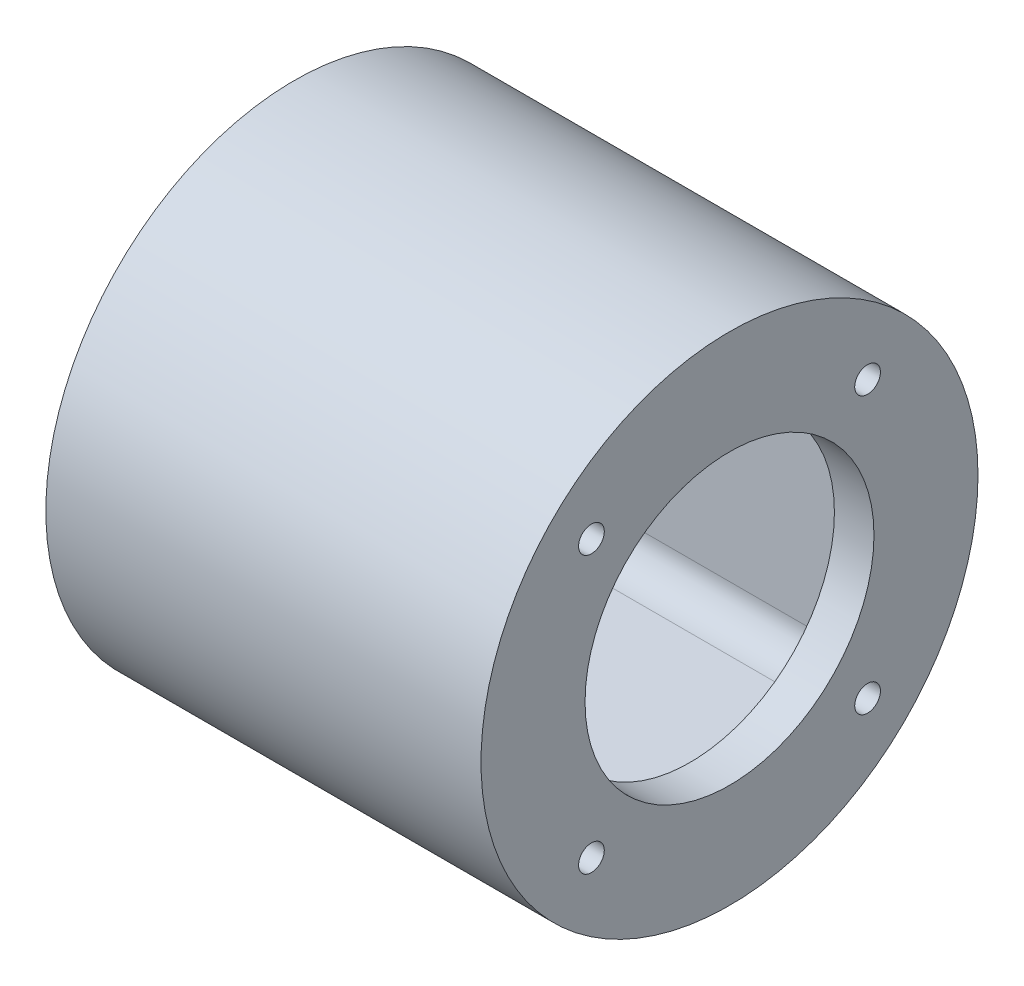
ISO-10303-21;
HEADER;
FILE_DESCRIPTION(('STEP AP214'),'2;1');
FILE_NAME('part.step','',(''),(''),'','','');
FILE_SCHEMA(('AUTOMOTIVE_DESIGN { 1 0 10303 214 1 1 1 1 }'));
ENDSEC;
DATA;
#1=APPLICATION_CONTEXT('core data for automotive mechanical design processes');
#2=APPLICATION_PROTOCOL_DEFINITION('international standard','automotive_design',2000,#1);
#3=PRODUCT_CONTEXT('',#1,'mechanical');
#4=PRODUCT('Part','Part','',(#3));
#5=PRODUCT_RELATED_PRODUCT_CATEGORY('part','',(#4));
#6=PRODUCT_DEFINITION_FORMATION('','',#4);
#7=PRODUCT_DEFINITION_CONTEXT('part definition',#1,'design');
#8=PRODUCT_DEFINITION('design','',#6,#7);
#9=PRODUCT_DEFINITION_SHAPE('','',#8);
#10=(LENGTH_UNIT() NAMED_UNIT(*) SI_UNIT(.MILLI.,.METRE.));
#11=(NAMED_UNIT(*) PLANE_ANGLE_UNIT() SI_UNIT($,.RADIAN.));
#12=(NAMED_UNIT(*) SI_UNIT($,.STERADIAN.) SOLID_ANGLE_UNIT());
#13=UNCERTAINTY_MEASURE_WITH_UNIT(LENGTH_MEASURE(1.E-05),#10,'distance_accuracy_value','');
#14=(GEOMETRIC_REPRESENTATION_CONTEXT(3) GLOBAL_UNCERTAINTY_ASSIGNED_CONTEXT((#13)) GLOBAL_UNIT_ASSIGNED_CONTEXT((#10,
#11,#12)) REPRESENTATION_CONTEXT('',''));
#15=CARTESIAN_POINT('',(0.,0.,0.));
#16=DIRECTION('',(0.,0.,1.));
#17=DIRECTION('',(1.,0.,0.));
#18=AXIS2_PLACEMENT_3D('',#15,#16,#17);
#19=CARTESIAN_POINT('',(0.,0.,0.));
#20=DIRECTION('',(1.,0.,0.));
#21=DIRECTION('',(0.,0.,-1.));
#22=AXIS2_PLACEMENT_3D('',#19,#20,#21);
#23=PLANE('',#22);
#24=CARTESIAN_POINT('',(0.,0.,0.));
#25=DIRECTION('',(1.,0.,0.));
#26=DIRECTION('',(0.,0.,-1.));
#27=AXIS2_PLACEMENT_3D('',#24,#25,#26);
#28=CIRCLE('',#27,36.5175);
#29=CARTESIAN_POINT('',(0.,0.,-36.5175));
#30=VERTEX_POINT('',#29);
#31=EDGE_CURVE('E45',#30,#30,#28,.T.);
#32=ORIENTED_EDGE('',*,*,#31,.T.);
#33=EDGE_LOOP('',(#32));
#34=FACE_BOUND('',#33,.T.);
#35=CARTESIAN_POINT('',(0.,34.9,34.9));
#36=DIRECTION('',(1.,0.,0.));
#37=DIRECTION('',(0.,0.,-1.));
#38=AXIS2_PLACEMENT_3D('',#35,#36,#37);
#39=CIRCLE('',#38,3.25);
#40=CARTESIAN_POINT('',(0.,34.9,31.65));
#41=VERTEX_POINT('',#40);
#42=EDGE_CURVE('E237',#41,#41,#39,.T.);
#43=ORIENTED_EDGE('',*,*,#42,.T.);
#44=EDGE_LOOP('',(#43));
#45=FACE_BOUND('',#44,.T.);
#46=CARTESIAN_POINT('',(0.,34.9,-34.9));
#47=DIRECTION('',(1.,0.,0.));
#48=DIRECTION('',(0.,0.,-1.));
#49=AXIS2_PLACEMENT_3D('',#46,#47,#48);
#50=CIRCLE('',#49,3.25);
#51=CARTESIAN_POINT('',(0.,34.9,-38.15));
#52=VERTEX_POINT('',#51);
#53=EDGE_CURVE('E234',#52,#52,#50,.T.);
#54=ORIENTED_EDGE('',*,*,#53,.T.);
#55=EDGE_LOOP('',(#54));
#56=FACE_BOUND('',#55,.T.);
#57=CARTESIAN_POINT('',(0.,-34.9,-34.9));
#58=DIRECTION('',(1.,0.,0.));
#59=DIRECTION('',(0.,0.,-1.));
#60=AXIS2_PLACEMENT_3D('',#57,#58,#59);
#61=CIRCLE('',#60,3.25);
#62=CARTESIAN_POINT('',(0.,-34.9,-38.15));
#63=VERTEX_POINT('',#62);
#64=EDGE_CURVE('E230',#63,#63,#61,.T.);
#65=ORIENTED_EDGE('',*,*,#64,.T.);
#66=EDGE_LOOP('',(#65));
#67=FACE_BOUND('',#66,.T.);
#68=CARTESIAN_POINT('',(0.,-34.9,34.9));
#69=DIRECTION('',(1.,0.,0.));
#70=DIRECTION('',(0.,0.,-1.));
#71=AXIS2_PLACEMENT_3D('',#68,#69,#70);
#72=CIRCLE('',#71,3.25);
#73=CARTESIAN_POINT('',(0.,-34.9,31.65));
#74=VERTEX_POINT('',#73);
#75=EDGE_CURVE('E185',#74,#74,#72,.T.);
#76=ORIENTED_EDGE('',*,*,#75,.T.);
#77=EDGE_LOOP('',(#76));
#78=FACE_BOUND('',#77,.T.);
#79=CARTESIAN_POINT('',(0.,34.9,-34.9));
#80=DIRECTION('',(1.,0.,0.));
#81=DIRECTION('',(0.,0.,-1.));
#82=AXIS2_PLACEMENT_3D('',#79,#80,#81);
#83=CIRCLE('',#82,8.1);
#84=CARTESIAN_POINT('',(0.,34.9,-43.));
#85=VERTEX_POINT('',#84);
#86=CARTESIAN_POINT('',(0.,43.,-34.9));
#87=VERTEX_POINT('',#86);
#88=EDGE_CURVE('E59',#85,#87,#83,.T.);
#89=ORIENTED_EDGE('',*,*,#88,.F.);
#90=DIRECTION('',(0.,1.,0.));
#91=VECTOR('',#90,1.);
#92=CARTESIAN_POINT('',(0.,0.,-43.));
#93=LINE('',#92,#91);
#94=CARTESIAN_POINT('',(0.,-34.9,-43.));
#95=VERTEX_POINT('',#94);
#96=EDGE_CURVE('E63',#95,#85,#93,.T.);
#97=ORIENTED_EDGE('',*,*,#96,.F.);
#98=CARTESIAN_POINT('',(0.,-34.9,-34.9));
#99=DIRECTION('',(1.,0.,0.));
#100=DIRECTION('',(0.,0.,-1.));
#101=AXIS2_PLACEMENT_3D('',#98,#99,#100);
#102=CIRCLE('',#101,8.10000000000001);
#103=CARTESIAN_POINT('',(0.,-43.,-34.9));
#104=VERTEX_POINT('',#103);
#105=EDGE_CURVE('E167',#104,#95,#102,.T.);
#106=ORIENTED_EDGE('',*,*,#105,.F.);
#107=DIRECTION('',(0.,0.,1.));
#108=VECTOR('',#107,1.);
#109=CARTESIAN_POINT('',(0.,-43.,0.));
#110=LINE('',#109,#108);
#111=CARTESIAN_POINT('',(0.,-43.,34.9));
#112=VERTEX_POINT('',#111);
#113=EDGE_CURVE('E170',#104,#112,#110,.T.);
#114=ORIENTED_EDGE('',*,*,#113,.T.);
#115=CARTESIAN_POINT('',(0.,-34.9,34.9));
#116=DIRECTION('',(1.,0.,0.));
#117=DIRECTION('',(0.,0.,-1.));
#118=AXIS2_PLACEMENT_3D('',#115,#116,#117);
#119=CIRCLE('',#118,8.09999999999999);
#120=CARTESIAN_POINT('',(0.,-34.9,43.));
#121=VERTEX_POINT('',#120);
#122=EDGE_CURVE('E173',#121,#112,#119,.T.);
#123=ORIENTED_EDGE('',*,*,#122,.F.);
#124=DIRECTION('',(0.,1.,0.));
#125=VECTOR('',#124,1.);
#126=CARTESIAN_POINT('',(0.,0.,43.));
#127=LINE('',#126,#125);
#128=CARTESIAN_POINT('',(0.,34.9,43.));
#129=VERTEX_POINT('',#128);
#130=EDGE_CURVE('E177',#121,#129,#127,.T.);
#131=ORIENTED_EDGE('',*,*,#130,.T.);
#132=CARTESIAN_POINT('',(0.,34.9,34.9));
#133=DIRECTION('',(1.,0.,0.));
#134=DIRECTION('',(0.,0.,-1.));
#135=AXIS2_PLACEMENT_3D('',#132,#133,#134);
#136=CIRCLE('',#135,8.09999999999998);
#137=CARTESIAN_POINT('',(0.,43.,34.9));
#138=VERTEX_POINT('',#137);
#139=EDGE_CURVE('E138',#138,#129,#136,.T.);
#140=ORIENTED_EDGE('',*,*,#139,.F.);
#141=DIRECTION('',(0.,0.,1.));
#142=VECTOR('',#141,1.);
#143=CARTESIAN_POINT('',(0.,43.,0.));
#144=LINE('',#143,#142);
#145=EDGE_CURVE('E134',#87,#138,#144,.T.);
#146=ORIENTED_EDGE('',*,*,#145,.F.);
#147=EDGE_LOOP('',(#89,#97,#106,#114,#123,#131,#140,#146));
#148=FACE_BOUND('',#147,.T.);
#149=ADVANCED_FACE('F41',(#34,#45,#56,#67,#78,#148),#23,.F.);
#150=CARTESIAN_POINT('',(10.,0.,0.));
#151=DIRECTION('',(-1.,0.,0.));
#152=DIRECTION('',(0.,0.,1.));
#153=AXIS2_PLACEMENT_3D('',#150,#151,#152);
#154=CYLINDRICAL_SURFACE('',#153,36.5175);
#155=CARTESIAN_POINT('',(10.,0.,0.));
#156=DIRECTION('',(1.,0.,0.));
#157=DIRECTION('',(0.,0.,-1.));
#158=AXIS2_PLACEMENT_3D('',#155,#156,#157);
#159=CIRCLE('',#158,36.5175);
#160=CARTESIAN_POINT('',(10.,0.,-36.5175));
#161=VERTEX_POINT('',#160);
#162=EDGE_CURVE('E51',#161,#161,#159,.T.);
#163=ORIENTED_EDGE('',*,*,#162,.T.);
#164=EDGE_LOOP('',(#163));
#165=FACE_BOUND('',#164,.T.);
#166=ORIENTED_EDGE('',*,*,#31,.F.);
#167=EDGE_LOOP('',(#166));
#168=FACE_BOUND('',#167,.T.);
#169=ADVANCED_FACE('F247',(#165,#168),#154,.F.);
#170=CARTESIAN_POINT('',(10.,34.9,34.9));
#171=DIRECTION('',(-1.,0.,0.));
#172=DIRECTION('',(0.,0.,1.));
#173=AXIS2_PLACEMENT_3D('',#170,#171,#172);
#174=CYLINDRICAL_SURFACE('',#173,3.25);
#175=CARTESIAN_POINT('',(10.,34.9,34.9));
#176=DIRECTION('',(1.,0.,0.));
#177=DIRECTION('',(0.,0.,-1.));
#178=AXIS2_PLACEMENT_3D('',#175,#176,#177);
#179=CIRCLE('',#178,3.25);
#180=CARTESIAN_POINT('',(10.,34.9,31.65));
#181=VERTEX_POINT('',#180);
#182=EDGE_CURVE('E220',#181,#181,#179,.T.);
#183=ORIENTED_EDGE('',*,*,#182,.T.);
#184=EDGE_LOOP('',(#183));
#185=FACE_BOUND('',#184,.T.);
#186=ORIENTED_EDGE('',*,*,#42,.F.);
#187=EDGE_LOOP('',(#186));
#188=FACE_BOUND('',#187,.T.);
#189=ADVANCED_FACE('F249',(#185,#188),#174,.F.);
#190=CARTESIAN_POINT('',(10.,34.9,-34.9));
#191=DIRECTION('',(-1.,0.,0.));
#192=DIRECTION('',(0.,0.,1.));
#193=AXIS2_PLACEMENT_3D('',#190,#191,#192);
#194=CYLINDRICAL_SURFACE('',#193,3.25);
#195=CARTESIAN_POINT('',(10.,34.9,-34.9));
#196=DIRECTION('',(1.,0.,0.));
#197=DIRECTION('',(0.,0.,-1.));
#198=AXIS2_PLACEMENT_3D('',#195,#196,#197);
#199=CIRCLE('',#198,3.25);
#200=CARTESIAN_POINT('',(10.,34.9,-38.15));
#201=VERTEX_POINT('',#200);
#202=EDGE_CURVE('E216',#201,#201,#199,.T.);
#203=ORIENTED_EDGE('',*,*,#202,.T.);
#204=EDGE_LOOP('',(#203));
#205=FACE_BOUND('',#204,.T.);
#206=ORIENTED_EDGE('',*,*,#53,.F.);
#207=EDGE_LOOP('',(#206));
#208=FACE_BOUND('',#207,.T.);
#209=ADVANCED_FACE('F256',(#205,#208),#194,.F.);
#210=CARTESIAN_POINT('',(10.,-34.9,-34.9));
#211=DIRECTION('',(-1.,0.,0.));
#212=DIRECTION('',(0.,0.,1.));
#213=AXIS2_PLACEMENT_3D('',#210,#211,#212);
#214=CYLINDRICAL_SURFACE('',#213,3.25);
#215=CARTESIAN_POINT('',(10.,-34.9,-34.9));
#216=DIRECTION('',(1.,0.,0.));
#217=DIRECTION('',(0.,0.,-1.));
#218=AXIS2_PLACEMENT_3D('',#215,#216,#217);
#219=CIRCLE('',#218,3.25);
#220=CARTESIAN_POINT('',(10.,-34.9,-38.15));
#221=VERTEX_POINT('',#220);
#222=EDGE_CURVE('E212',#221,#221,#219,.T.);
#223=ORIENTED_EDGE('',*,*,#222,.T.);
#224=EDGE_LOOP('',(#223));
#225=FACE_BOUND('',#224,.T.);
#226=ORIENTED_EDGE('',*,*,#64,.F.);
#227=EDGE_LOOP('',(#226));
#228=FACE_BOUND('',#227,.T.);
#229=ADVANCED_FACE('F264',(#225,#228),#214,.F.);
#230=CARTESIAN_POINT('',(10.,-34.9,34.9));
#231=DIRECTION('',(-1.,0.,0.));
#232=DIRECTION('',(0.,0.,1.));
#233=AXIS2_PLACEMENT_3D('',#230,#231,#232);
#234=CYLINDRICAL_SURFACE('',#233,3.25);
#235=CARTESIAN_POINT('',(10.,-34.9,34.9));
#236=DIRECTION('',(1.,0.,0.));
#237=DIRECTION('',(0.,0.,-1.));
#238=AXIS2_PLACEMENT_3D('',#235,#236,#237);
#239=CIRCLE('',#238,3.25);
#240=CARTESIAN_POINT('',(10.,-34.9,31.65));
#241=VERTEX_POINT('',#240);
#242=EDGE_CURVE('E208',#241,#241,#239,.T.);
#243=ORIENTED_EDGE('',*,*,#242,.T.);
#244=EDGE_LOOP('',(#243));
#245=FACE_BOUND('',#244,.T.);
#246=ORIENTED_EDGE('',*,*,#75,.F.);
#247=EDGE_LOOP('',(#246));
#248=FACE_BOUND('',#247,.T.);
#249=ADVANCED_FACE('F43',(#245,#248),#234,.F.);
#250=CARTESIAN_POINT('',(10.,0.,0.));
#251=DIRECTION('',(-1.,0.,0.));
#252=DIRECTION('',(0.,0.,1.));
#253=AXIS2_PLACEMENT_3D('',#250,#251,#252);
#254=CYLINDRICAL_SURFACE('',#253,62.8111831820431);
#255=CARTESIAN_POINT('',(10.,0.,0.));
#256=DIRECTION('',(1.,0.,0.));
#257=DIRECTION('',(0.,0.,-1.));
#258=AXIS2_PLACEMENT_3D('',#255,#256,#257);
#259=CIRCLE('',#258,62.8111831820431);
#260=CARTESIAN_POINT('',(10.,0.,-62.8111831820431));
#261=VERTEX_POINT('',#260);
#262=EDGE_CURVE('E11',#261,#261,#259,.T.);
#263=ORIENTED_EDGE('',*,*,#262,.F.);
#264=EDGE_LOOP('',(#263));
#265=FACE_BOUND('',#264,.T.);
#266=CARTESIAN_POINT('',(-100.,0.,0.));
#267=DIRECTION('',(1.,0.,0.));
#268=DIRECTION('',(0.,0.,-1.));
#269=AXIS2_PLACEMENT_3D('',#266,#267,#268);
#270=CIRCLE('',#269,62.8111831820431);
#271=CARTESIAN_POINT('',(-100.,0.,-62.8111831820431));
#272=VERTEX_POINT('',#271);
#273=EDGE_CURVE('E128',#272,#272,#270,.T.);
#274=ORIENTED_EDGE('',*,*,#273,.T.);
#275=EDGE_LOOP('',(#274));
#276=FACE_BOUND('',#275,.T.);
#277=ADVANCED_FACE('F261',(#265,#276),#254,.T.);
#278=CARTESIAN_POINT('',(10.,0.,0.));
#279=DIRECTION('',(1.,0.,0.));
#280=DIRECTION('',(0.,0.,-1.));
#281=AXIS2_PLACEMENT_3D('',#278,#279,#280);
#282=PLANE('',#281);
#283=ORIENTED_EDGE('',*,*,#242,.F.);
#284=EDGE_LOOP('',(#283));
#285=FACE_BOUND('',#284,.T.);
#286=ORIENTED_EDGE('',*,*,#222,.F.);
#287=EDGE_LOOP('',(#286));
#288=FACE_BOUND('',#287,.T.);
#289=ORIENTED_EDGE('',*,*,#202,.F.);
#290=EDGE_LOOP('',(#289));
#291=FACE_BOUND('',#290,.T.);
#292=ORIENTED_EDGE('',*,*,#182,.F.);
#293=EDGE_LOOP('',(#292));
#294=FACE_BOUND('',#293,.T.);
#295=ORIENTED_EDGE('',*,*,#162,.F.);
#296=EDGE_LOOP('',(#295));
#297=FACE_BOUND('',#296,.T.);
#298=ORIENTED_EDGE('',*,*,#262,.T.);
#299=EDGE_LOOP('',(#298));
#300=FACE_BOUND('',#299,.T.);
#301=ADVANCED_FACE('F280',(#285,#288,#291,#294,#297,#300),#282,.T.);
#302=CARTESIAN_POINT('',(-100.,34.9,-34.9));
#303=DIRECTION('',(1.,0.,0.));
#304=DIRECTION('',(0.,0.,-1.));
#305=AXIS2_PLACEMENT_3D('',#302,#303,#304);
#306=CYLINDRICAL_SURFACE('',#305,8.1);
#307=ORIENTED_EDGE('',*,*,#88,.T.);
#308=DIRECTION('',(1.,0.,0.));
#309=VECTOR('',#308,1.);
#310=CARTESIAN_POINT('',(-100.,43.,-34.9));
#311=LINE('',#310,#309);
#312=CARTESIAN_POINT('',(-100.,43.,-34.9));
#313=VERTEX_POINT('',#312);
#314=EDGE_CURVE('E132',#313,#87,#311,.T.);
#315=ORIENTED_EDGE('',*,*,#314,.F.);
#316=CARTESIAN_POINT('',(-100.,34.9,-34.9));
#317=DIRECTION('',(1.,0.,0.));
#318=DIRECTION('',(0.,0.,-1.));
#319=AXIS2_PLACEMENT_3D('',#316,#317,#318);
#320=CIRCLE('',#319,8.1);
#321=CARTESIAN_POINT('',(-100.,34.9,-43.));
#322=VERTEX_POINT('',#321);
#323=EDGE_CURVE('E112',#322,#313,#320,.T.);
#324=ORIENTED_EDGE('',*,*,#323,.F.);
#325=DIRECTION('',(1.,0.,0.));
#326=VECTOR('',#325,1.);
#327=CARTESIAN_POINT('',(-100.,34.9,-43.));
#328=LINE('',#327,#326);
#329=EDGE_CURVE('E123',#322,#85,#328,.T.);
#330=ORIENTED_EDGE('',*,*,#329,.T.);
#331=EDGE_LOOP('',(#307,#315,#324,#330));
#332=FACE_BOUND('',#331,.T.);
#333=ADVANCED_FACE('F130',(#332),#306,.F.);
#334=CARTESIAN_POINT('',(-100.,43.,0.));
#335=DIRECTION('',(0.,1.,0.));
#336=DIRECTION('',(0.,0.,1.));
#337=AXIS2_PLACEMENT_3D('',#334,#335,#336);
#338=PLANE('',#337);
#339=ORIENTED_EDGE('',*,*,#145,.T.);
#340=DIRECTION('',(1.,0.,0.));
#341=VECTOR('',#340,1.);
#342=CARTESIAN_POINT('',(-100.,43.,34.9));
#343=LINE('',#342,#341);
#344=CARTESIAN_POINT('',(-100.,43.,34.9));
#345=VERTEX_POINT('',#344);
#346=EDGE_CURVE('E186',#345,#138,#343,.T.);
#347=ORIENTED_EDGE('',*,*,#346,.F.);
#348=DIRECTION('',(0.,0.,1.));
#349=VECTOR('',#348,1.);
#350=CARTESIAN_POINT('',(-100.,43.,0.));
#351=LINE('',#350,#349);
#352=EDGE_CURVE('E157',#313,#345,#351,.T.);
#353=ORIENTED_EDGE('',*,*,#352,.F.);
#354=ORIENTED_EDGE('',*,*,#314,.T.);
#355=EDGE_LOOP('',(#339,#347,#353,#354));
#356=FACE_BOUND('',#355,.T.);
#357=ADVANCED_FACE('F304',(#356),#338,.F.);
#358=CARTESIAN_POINT('',(-100.,34.9,34.9));
#359=DIRECTION('',(1.,0.,0.));
#360=DIRECTION('',(0.,0.,-1.));
#361=AXIS2_PLACEMENT_3D('',#358,#359,#360);
#362=CYLINDRICAL_SURFACE('',#361,8.09999999999998);
#363=ORIENTED_EDGE('',*,*,#139,.T.);
#364=DIRECTION('',(1.,0.,0.));
#365=VECTOR('',#364,1.);
#366=CARTESIAN_POINT('',(-100.,34.9,43.));
#367=LINE('',#366,#365);
#368=CARTESIAN_POINT('',(-100.,34.9,43.));
#369=VERTEX_POINT('',#368);
#370=EDGE_CURVE('E190',#369,#129,#367,.T.);
#371=ORIENTED_EDGE('',*,*,#370,.F.);
#372=CARTESIAN_POINT('',(-100.,34.9,34.9));
#373=DIRECTION('',(1.,0.,0.));
#374=DIRECTION('',(0.,0.,-1.));
#375=AXIS2_PLACEMENT_3D('',#372,#373,#374);
#376=CIRCLE('',#375,8.09999999999998);
#377=EDGE_CURVE('E154',#345,#369,#376,.T.);
#378=ORIENTED_EDGE('',*,*,#377,.F.);
#379=ORIENTED_EDGE('',*,*,#346,.T.);
#380=EDGE_LOOP('',(#363,#371,#378,#379));
#381=FACE_BOUND('',#380,.T.);
#382=ADVANCED_FACE('F307',(#381),#362,.F.);
#383=CARTESIAN_POINT('',(-100.,0.,43.));
#384=DIRECTION('',(0.,0.,-1.));
#385=DIRECTION('',(0.,1.,0.));
#386=AXIS2_PLACEMENT_3D('',#383,#384,#385);
#387=PLANE('',#386);
#388=ORIENTED_EDGE('',*,*,#130,.F.);
#389=DIRECTION('',(1.,0.,0.));
#390=VECTOR('',#389,1.);
#391=CARTESIAN_POINT('',(-100.,-34.9,43.));
#392=LINE('',#391,#390);
#393=CARTESIAN_POINT('',(-100.,-34.9,43.));
#394=VERTEX_POINT('',#393);
#395=EDGE_CURVE('E194',#394,#121,#392,.T.);
#396=ORIENTED_EDGE('',*,*,#395,.F.);
#397=DIRECTION('',(0.,1.,0.));
#398=VECTOR('',#397,1.);
#399=CARTESIAN_POINT('',(-100.,0.,43.));
#400=LINE('',#399,#398);
#401=EDGE_CURVE('E150',#394,#369,#400,.T.);
#402=ORIENTED_EDGE('',*,*,#401,.T.);
#403=ORIENTED_EDGE('',*,*,#370,.T.);
#404=EDGE_LOOP('',(#388,#396,#402,#403));
#405=FACE_BOUND('',#404,.T.);
#406=ADVANCED_FACE('F311',(#405),#387,.T.);
#407=CARTESIAN_POINT('',(-100.,-34.9,34.9));
#408=DIRECTION('',(1.,0.,0.));
#409=DIRECTION('',(0.,0.,-1.));
#410=AXIS2_PLACEMENT_3D('',#407,#408,#409);
#411=CYLINDRICAL_SURFACE('',#410,8.09999999999999);
#412=ORIENTED_EDGE('',*,*,#122,.T.);
#413=DIRECTION('',(1.,0.,0.));
#414=VECTOR('',#413,1.);
#415=CARTESIAN_POINT('',(-100.,-43.,34.9));
#416=LINE('',#415,#414);
#417=CARTESIAN_POINT('',(-100.,-43.,34.9));
#418=VERTEX_POINT('',#417);
#419=EDGE_CURVE('E198',#418,#112,#416,.T.);
#420=ORIENTED_EDGE('',*,*,#419,.F.);
#421=CARTESIAN_POINT('',(-100.,-34.9,34.9));
#422=DIRECTION('',(1.,0.,0.));
#423=DIRECTION('',(0.,0.,-1.));
#424=AXIS2_PLACEMENT_3D('',#421,#422,#423);
#425=CIRCLE('',#424,8.09999999999999);
#426=EDGE_CURVE('E147',#394,#418,#425,.T.);
#427=ORIENTED_EDGE('',*,*,#426,.F.);
#428=ORIENTED_EDGE('',*,*,#395,.T.);
#429=EDGE_LOOP('',(#412,#420,#427,#428));
#430=FACE_BOUND('',#429,.T.);
#431=ADVANCED_FACE('F315',(#430),#411,.F.);
#432=CARTESIAN_POINT('',(-100.,-43.,0.));
#433=DIRECTION('',(0.,1.,0.));
#434=DIRECTION('',(0.,0.,1.));
#435=AXIS2_PLACEMENT_3D('',#432,#433,#434);
#436=PLANE('',#435);
#437=ORIENTED_EDGE('',*,*,#113,.F.);
#438=DIRECTION('',(1.,0.,0.));
#439=VECTOR('',#438,1.);
#440=CARTESIAN_POINT('',(-100.,-43.,-34.9));
#441=LINE('',#440,#439);
#442=CARTESIAN_POINT('',(-100.,-43.,-34.9));
#443=VERTEX_POINT('',#442);
#444=EDGE_CURVE('E202',#443,#104,#441,.T.);
#445=ORIENTED_EDGE('',*,*,#444,.F.);
#446=DIRECTION('',(0.,0.,1.));
#447=VECTOR('',#446,1.);
#448=CARTESIAN_POINT('',(-100.,-43.,0.));
#449=LINE('',#448,#447);
#450=EDGE_CURVE('E143',#443,#418,#449,.T.);
#451=ORIENTED_EDGE('',*,*,#450,.T.);
#452=ORIENTED_EDGE('',*,*,#419,.T.);
#453=EDGE_LOOP('',(#437,#445,#451,#452));
#454=FACE_BOUND('',#453,.T.);
#455=ADVANCED_FACE('F319',(#454),#436,.T.);
#456=CARTESIAN_POINT('',(-100.,-34.9,-34.9));
#457=DIRECTION('',(1.,0.,0.));
#458=DIRECTION('',(0.,0.,-1.));
#459=AXIS2_PLACEMENT_3D('',#456,#457,#458);
#460=CYLINDRICAL_SURFACE('',#459,8.10000000000001);
#461=ORIENTED_EDGE('',*,*,#105,.T.);
#462=DIRECTION('',(1.,0.,0.));
#463=VECTOR('',#462,1.);
#464=CARTESIAN_POINT('',(-100.,-34.9,-43.));
#465=LINE('',#464,#463);
#466=CARTESIAN_POINT('',(-100.,-34.9,-43.));
#467=VERTEX_POINT('',#466);
#468=EDGE_CURVE('E127',#467,#95,#465,.T.);
#469=ORIENTED_EDGE('',*,*,#468,.F.);
#470=CARTESIAN_POINT('',(-100.,-34.9,-34.9));
#471=DIRECTION('',(1.,0.,0.));
#472=DIRECTION('',(0.,0.,-1.));
#473=AXIS2_PLACEMENT_3D('',#470,#471,#472);
#474=CIRCLE('',#473,8.10000000000001);
#475=EDGE_CURVE('E116',#443,#467,#474,.T.);
#476=ORIENTED_EDGE('',*,*,#475,.F.);
#477=ORIENTED_EDGE('',*,*,#444,.T.);
#478=EDGE_LOOP('',(#461,#469,#476,#477));
#479=FACE_BOUND('',#478,.T.);
#480=ADVANCED_FACE('F301',(#479),#460,.F.);
#481=CARTESIAN_POINT('',(-100.,0.,-43.));
#482=DIRECTION('',(0.,0.,-1.));
#483=DIRECTION('',(0.,1.,0.));
#484=AXIS2_PLACEMENT_3D('',#481,#482,#483);
#485=PLANE('',#484);
#486=ORIENTED_EDGE('',*,*,#96,.T.);
#487=ORIENTED_EDGE('',*,*,#329,.F.);
#488=DIRECTION('',(0.,1.,0.));
#489=VECTOR('',#488,1.);
#490=CARTESIAN_POINT('',(-100.,0.,-43.));
#491=LINE('',#490,#489);
#492=EDGE_CURVE('E107',#467,#322,#491,.T.);
#493=ORIENTED_EDGE('',*,*,#492,.F.);
#494=ORIENTED_EDGE('',*,*,#468,.T.);
#495=EDGE_LOOP('',(#486,#487,#493,#494));
#496=FACE_BOUND('',#495,.T.);
#497=ADVANCED_FACE('F124',(#496),#485,.F.);
#498=CARTESIAN_POINT('',(-100.,0.,0.));
#499=DIRECTION('',(1.,0.,0.));
#500=DIRECTION('',(0.,0.,-1.));
#501=AXIS2_PLACEMENT_3D('',#498,#499,#500);
#502=PLANE('',#501);
#503=ORIENTED_EDGE('',*,*,#323,.T.);
#504=ORIENTED_EDGE('',*,*,#352,.T.);
#505=ORIENTED_EDGE('',*,*,#377,.T.);
#506=ORIENTED_EDGE('',*,*,#401,.F.);
#507=ORIENTED_EDGE('',*,*,#426,.T.);
#508=ORIENTED_EDGE('',*,*,#450,.F.);
#509=ORIENTED_EDGE('',*,*,#475,.T.);
#510=ORIENTED_EDGE('',*,*,#492,.T.);
#511=EDGE_LOOP('',(#503,#504,#505,#506,#507,#508,#509,#510));
#512=FACE_BOUND('',#511,.T.);
#513=ORIENTED_EDGE('',*,*,#273,.F.);
#514=EDGE_LOOP('',(#513));
#515=FACE_BOUND('',#514,.T.);
#516=ADVANCED_FACE('F109',(#512,#515),#502,.F.);
#517=CLOSED_SHELL('',(#149,#169,#189,#209,#229,#249,#277,#301,#333,#357,#382,#406,#431,#455,
#480,#497,#516));
#518=MANIFOLD_SOLID_BREP('B2',#517);
#519=ADVANCED_BREP_SHAPE_REPRESENTATION('',(#18,#518),#14);
#520=SHAPE_DEFINITION_REPRESENTATION(#9,#519);
ENDSEC;
END-ISO-10303-21;
